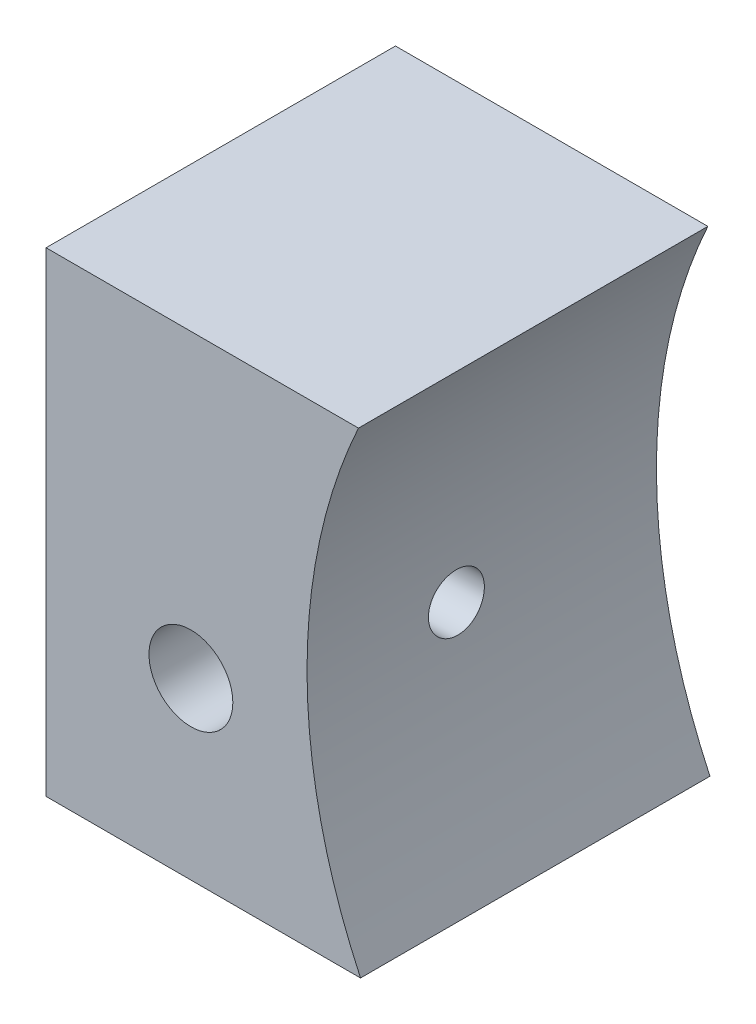
ISO-10303-21;
HEADER;
FILE_DESCRIPTION(('STEP AP214'),'2;1');
FILE_NAME('part.step','',(''),(''),'','','');
FILE_SCHEMA(('AUTOMOTIVE_DESIGN { 1 0 10303 214 1 1 1 1 }'));
ENDSEC;
DATA;
#1=APPLICATION_CONTEXT('core data for automotive mechanical design processes');
#2=APPLICATION_PROTOCOL_DEFINITION('international standard','automotive_design',2000,#1);
#3=PRODUCT_CONTEXT('',#1,'mechanical');
#4=PRODUCT('Part','Part','',(#3));
#5=PRODUCT_RELATED_PRODUCT_CATEGORY('part','',(#4));
#6=PRODUCT_DEFINITION_FORMATION('','',#4);
#7=PRODUCT_DEFINITION_CONTEXT('part definition',#1,'design');
#8=PRODUCT_DEFINITION('design','',#6,#7);
#9=PRODUCT_DEFINITION_SHAPE('','',#8);
#10=(LENGTH_UNIT() NAMED_UNIT(*) SI_UNIT(.MILLI.,.METRE.));
#11=(NAMED_UNIT(*) PLANE_ANGLE_UNIT() SI_UNIT($,.RADIAN.));
#12=(NAMED_UNIT(*) SI_UNIT($,.STERADIAN.) SOLID_ANGLE_UNIT());
#13=UNCERTAINTY_MEASURE_WITH_UNIT(LENGTH_MEASURE(1.E-05),#10,'distance_accuracy_value','');
#14=(GEOMETRIC_REPRESENTATION_CONTEXT(3) GLOBAL_UNCERTAINTY_ASSIGNED_CONTEXT((#13)) GLOBAL_UNIT_ASSIGNED_CONTEXT((#10,
#11,#12)) REPRESENTATION_CONTEXT('',''));
#15=CARTESIAN_POINT('',(0.,0.,0.));
#16=DIRECTION('',(0.,0.,1.));
#17=DIRECTION('',(1.,0.,0.));
#18=AXIS2_PLACEMENT_3D('',#15,#16,#17);
#19=CARTESIAN_POINT('',(118.09436297306,34.31875,0.));
#20=DIRECTION('',(0.,0.,1.));
#21=DIRECTION('',(1.,0.,0.));
#22=AXIS2_PLACEMENT_3D('',#19,#20,#21);
#23=PLANE('',#22);
#24=DIRECTION('',(1.,0.,0.));
#25=VECTOR('',#24,1.);
#26=CARTESIAN_POINT('',(0.,0.,0.));
#27=LINE('',#26,#25);
#28=CARTESIAN_POINT('',(0.,0.,0.));
#29=VERTEX_POINT('',#28);
#30=CARTESIAN_POINT('',(45.,0.,0.));
#31=VERTEX_POINT('',#30);
#32=EDGE_CURVE('E142',#29,#31,#27,.T.);
#33=ORIENTED_EDGE('',*,*,#32,.F.);
#34=DIRECTION('',(0.,-1.,0.));
#35=VECTOR('',#34,1.);
#36=CARTESIAN_POINT('',(0.,0.,0.));
#37=LINE('',#36,#35);
#38=CARTESIAN_POINT('',(0.,68.,0.));
#39=VERTEX_POINT('',#38);
#40=EDGE_CURVE('E90',#39,#29,#37,.T.);
#41=ORIENTED_EDGE('',*,*,#40,.F.);
#42=DIRECTION('',(-1.,0.,0.));
#43=VECTOR('',#42,1.);
#44=CARTESIAN_POINT('',(0.,68.,0.));
#45=LINE('',#44,#43);
#46=CARTESIAN_POINT('',(44.7040645785348,68.,0.));
#47=VERTEX_POINT('',#46);
#48=EDGE_CURVE('E173',#47,#39,#45,.T.);
#49=ORIENTED_EDGE('',*,*,#48,.F.);
#50=CARTESIAN_POINT('',(118.09436297306,34.31875,0.));
#51=DIRECTION('',(0.,0.,-1.));
#52=DIRECTION('',(1.,0.,0.));
#53=AXIS2_PLACEMENT_3D('',#50,#51,#52);
#54=CIRCLE('',#53,80.75);
#55=EDGE_CURVE('E146',#31,#47,#54,.T.);
#56=ORIENTED_EDGE('',*,*,#55,.F.);
#57=EDGE_LOOP('',(#33,#41,#49,#56));
#58=FACE_BOUND('',#57,.T.);
#59=DIRECTION('',(0.,-1.,0.));
#60=VECTOR('',#59,1.);
#61=CARTESIAN_POINT('',(10.,0.,0.));
#62=LINE('',#61,#60);
#63=CARTESIAN_POINT('',(10.,58.,0.));
#64=VERTEX_POINT('',#63);
#65=CARTESIAN_POINT('',(10.,10.,0.));
#66=VERTEX_POINT('',#65);
#67=EDGE_CURVE('E137',#64,#66,#62,.T.);
#68=ORIENTED_EDGE('',*,*,#67,.T.);
#69=DIRECTION('',(1.,0.,0.));
#70=VECTOR('',#69,1.);
#71=CARTESIAN_POINT('',(0.,10.,0.));
#72=LINE('',#71,#70);
#73=CARTESIAN_POINT('',(30.6634708442624,10.,0.));
#74=VERTEX_POINT('',#73);
#75=EDGE_CURVE('E159',#66,#74,#72,.T.);
#76=ORIENTED_EDGE('',*,*,#75,.T.);
#77=CARTESIAN_POINT('',(118.09436297306,34.31875,0.));
#78=DIRECTION('',(0.,0.,1.));
#79=DIRECTION('',(1.,0.,0.));
#80=AXIS2_PLACEMENT_3D('',#77,#78,#79);
#81=CIRCLE('',#80,90.75);
#82=CARTESIAN_POINT('',(30.4886502687082,58.,0.));
#83=VERTEX_POINT('',#82);
#84=EDGE_CURVE('E141',#74,#83,#81,.F.);
#85=ORIENTED_EDGE('',*,*,#84,.T.);
#86=DIRECTION('',(-1.,0.,0.));
#87=VECTOR('',#86,1.);
#88=CARTESIAN_POINT('',(0.,58.,0.));
#89=LINE('',#88,#87);
#90=EDGE_CURVE('E60',#83,#64,#89,.T.);
#91=ORIENTED_EDGE('',*,*,#90,.T.);
#92=EDGE_LOOP('',(#68,#76,#85,#91));
#93=FACE_BOUND('',#92,.T.);
#94=ADVANCED_FACE('F45',(#58,#93),#23,.F.);
#95=CARTESIAN_POINT('',(0.,0.,50.));
#96=DIRECTION('',(0.,1.,0.));
#97=DIRECTION('',(0.,0.,1.));
#98=AXIS2_PLACEMENT_3D('',#95,#96,#97);
#99=PLANE('',#98);
#100=ORIENTED_EDGE('',*,*,#32,.T.);
#101=DIRECTION('',(0.,0.,-1.));
#102=VECTOR('',#101,1.);
#103=CARTESIAN_POINT('',(45.,0.,50.));
#104=LINE('',#103,#102);
#105=CARTESIAN_POINT('',(45.,0.,50.));
#106=VERTEX_POINT('',#105);
#107=EDGE_CURVE('E13',#106,#31,#104,.T.);
#108=ORIENTED_EDGE('',*,*,#107,.F.);
#109=DIRECTION('',(1.,0.,0.));
#110=VECTOR('',#109,1.);
#111=CARTESIAN_POINT('',(0.,0.,50.));
#112=LINE('',#111,#110);
#113=CARTESIAN_POINT('',(0.,0.,50.));
#114=VERTEX_POINT('',#113);
#115=EDGE_CURVE('E165',#114,#106,#112,.T.);
#116=ORIENTED_EDGE('',*,*,#115,.F.);
#117=DIRECTION('',(0.,0.,-1.));
#118=VECTOR('',#117,1.);
#119=CARTESIAN_POINT('',(0.,0.,50.));
#120=LINE('',#119,#118);
#121=EDGE_CURVE('E170',#114,#29,#120,.T.);
#122=ORIENTED_EDGE('',*,*,#121,.T.);
#123=EDGE_LOOP('',(#100,#108,#116,#122));
#124=FACE_BOUND('',#123,.T.);
#125=ADVANCED_FACE('F47',(#124),#99,.F.);
#126=CARTESIAN_POINT('',(118.09436297306,34.31875,50.));
#127=DIRECTION('',(0.,0.,-1.));
#128=DIRECTION('',(-1.,0.,0.));
#129=AXIS2_PLACEMENT_3D('',#126,#127,#128);
#130=CYLINDRICAL_SURFACE('',#129,80.75);
#131=CARTESIAN_POINT('',(37.3746104368453,32.1087612008884,24.6578773271621));
#132=CARTESIAN_POINT('',(37.3807568795896,31.8843110658417,24.6578872374668));
#133=CARTESIAN_POINT('',(37.3878512210671,31.6597275242141,24.6768466668234));
#134=CARTESIAN_POINT('',(37.4036589538892,31.2168053991997,24.7522108195903));
#135=CARTESIAN_POINT('',(37.4123742448805,30.9984744935407,24.8086596797843));
#136=CARTESIAN_POINT('',(37.4309367804109,30.5745309010088,24.9573827069967));
#137=CARTESIAN_POINT('',(37.4407834469454,30.3689118017045,25.0496386374512));
#138=CARTESIAN_POINT('',(37.4609759097406,29.9761574115352,25.2673290299811));
#139=CARTESIAN_POINT('',(37.4713215875881,29.7890177673867,25.3927556521649));
#140=CARTESIAN_POINT('',(37.4917919200748,29.4382806426157,25.6733659566985));
#141=CARTESIAN_POINT('',(37.5019163747488,29.2747037697858,25.8285754135279));
#142=CARTESIAN_POINT('',(37.5211732109015,28.9758979159542,26.1642941935347));
#143=CARTESIAN_POINT('',(37.5303055518767,28.8406700921047,26.3448045489432));
#144=CARTESIAN_POINT('',(37.5468651989115,28.6023320361869,26.7261087630638));
#145=CARTESIAN_POINT('',(37.5542916538709,28.4992378270944,26.9269126750007));
#146=CARTESIAN_POINT('',(37.5668332935314,28.3281856034591,27.3430331397898));
#147=CARTESIAN_POINT('',(37.5719484955321,28.2602273259232,27.5583495840018));
#148=CARTESIAN_POINT('',(37.579443238675,28.1614227290926,27.9971939724753));
#149=CARTESIAN_POINT('',(37.5818250432235,28.1305457034551,28.2207149643857));
#150=CARTESIAN_POINT('',(37.5836626970293,28.1066818084065,28.6697813761541));
#151=CARTESIAN_POINT('',(37.5831185690469,28.1136946442566,28.8953267802508));
#152=CARTESIAN_POINT('',(37.5791515173443,28.1653866348335,29.3418305647575));
#153=CARTESIAN_POINT('',(37.5757311291072,28.2100326152455,29.5627928095904));
#154=CARTESIAN_POINT('',(37.5662978288935,28.335677224151,29.9940696962135));
#155=CARTESIAN_POINT('',(37.5602849061128,28.4166760041395,30.204384293627));
#156=CARTESIAN_POINT('',(37.5461540994893,28.6127736009246,30.6085028830176));
#157=CARTESIAN_POINT('',(37.5380352817041,28.7278875506769,30.802299498651));
#158=CARTESIAN_POINT('',(37.5203425183651,28.988948257962,31.1678002650064));
#159=CARTESIAN_POINT('',(37.5107685627424,29.134895228844,31.3395042628451));
#160=CARTESIAN_POINT('',(37.4908949521376,29.4536792223729,31.6561391688483));
#161=CARTESIAN_POINT('',(37.4805945273034,29.6265450129063,31.8010410671412));
#162=CARTESIAN_POINT('',(37.4600380478702,29.9941715107648,32.0597350036579));
#163=CARTESIAN_POINT('',(37.449781993282,30.1889322234114,32.1735270343205));
#164=CARTESIAN_POINT('',(37.4300195543148,30.5948483145438,32.3667683025164));
#165=CARTESIAN_POINT('',(37.420513191977,30.8060041746918,32.4462165306352));
#166=CARTESIAN_POINT('',(37.4028345693399,31.2387177097072,32.5684960005832));
#167=CARTESIAN_POINT('',(37.3946622992372,31.4602753081243,32.6113275114923));
#168=CARTESIAN_POINT('',(37.3800697282641,31.9072562553582,32.6591219687068));
#169=CARTESIAN_POINT('',(37.3736475779377,32.1326752536607,32.6641250413448));
#170=CARTESIAN_POINT('',(37.3627473725597,32.5812019204344,32.636225315246));
#171=CARTESIAN_POINT('',(37.3582693111995,32.8043095964037,32.6033226395175));
#172=CARTESIAN_POINT('',(37.3512489628592,33.2417642350766,32.5005786146279));
#173=CARTESIAN_POINT('',(37.3487057174108,33.4561154856679,32.4307555841558));
#174=CARTESIAN_POINT('',(37.3453437621743,33.8700977490188,32.2561714419016));
#175=CARTESIAN_POINT('',(37.3445250621282,34.0697286786159,32.1514101327544));
#176=CARTESIAN_POINT('',(37.3442447214512,34.4487771402456,31.9098204721075));
#177=CARTESIAN_POINT('',(37.3447842229823,34.6281775271364,31.7729652193695));
#178=CARTESIAN_POINT('',(37.3467486132194,34.961487191517,31.4711117995039));
#179=CARTESIAN_POINT('',(37.3481735075063,35.1153963083165,31.3061134549829));
#180=CARTESIAN_POINT('',(37.3513950215112,35.3934766721276,30.9524849492222));
#181=CARTESIAN_POINT('',(37.3531919632117,35.5176219583323,30.7638343746887));
#182=CARTESIAN_POINT('',(37.3566672239115,35.7324611099012,30.3683596773279));
#183=CARTESIAN_POINT('',(37.3583455434198,35.823155118837,30.1615356325053));
#184=CARTESIAN_POINT('',(37.3611835160575,35.9684623090216,29.7356811909144));
#185=CARTESIAN_POINT('',(37.3623434072923,36.0230920595018,29.5166564498159));
#186=CARTESIAN_POINT('',(37.3638881521092,36.0947680511964,29.0725387528664));
#187=CARTESIAN_POINT('',(37.3642730099835,36.1118145005596,28.8474458306301));
#188=CARTESIAN_POINT('',(37.3641847663751,36.1078360479694,28.3978397692256));
#189=CARTESIAN_POINT('',(37.3637125861794,36.0868520275282,28.173326266978));
#190=CARTESIAN_POINT('',(37.3620138608131,36.007495208418,27.7310103768305));
#191=CARTESIAN_POINT('',(37.3607873142027,35.9491223383921,27.5132080017396));
#192=CARTESIAN_POINT('',(37.3578529096789,35.7966596391878,27.0904883138793));
#193=CARTESIAN_POINT('',(37.3561450480518,35.7025695344138,26.8855711005464));
#194=CARTESIAN_POINT('',(37.3526573922934,35.4813602518458,26.4944259939258));
#195=CARTESIAN_POINT('',(37.350877600382,35.3542420926745,26.3081975245013));
#196=CARTESIAN_POINT('',(37.3477373787116,35.0704511723846,25.9595124384442));
#197=CARTESIAN_POINT('',(37.3463773554282,34.9137500001746,25.7970789427074));
#198=CARTESIAN_POINT('',(37.344593465728,34.5752719125296,25.5007574162014));
#199=CARTESIAN_POINT('',(37.3441698297408,34.3934888365345,25.3668764190612));
#200=CARTESIAN_POINT('',(37.3447258313263,34.009878965915,25.1313988427333));
#201=CARTESIAN_POINT('',(37.3457068011267,33.8080333115543,25.0298330252713));
#202=CARTESIAN_POINT('',(37.3494314301799,33.3903254739539,24.8621451107246));
#203=CARTESIAN_POINT('',(37.3521729983707,33.1744801911068,24.7959811375555));
#204=CARTESIAN_POINT('',(37.3582293287252,32.8158716946509,24.7183351965825));
#205=CARTESIAN_POINT('',(37.360962738357,32.6754165527053,24.6956924283148));
#206=CARTESIAN_POINT('',(37.3672075951492,32.3929124978143,24.6654603627273));
#207=CARTESIAN_POINT('',(37.3707190416586,32.2508635862021,24.6578710528155));
#208=CARTESIAN_POINT('',(37.3746104368453,32.1087612008884,24.6578773271621));
#209=B_SPLINE_CURVE_WITH_KNOTS('',3,(#131,#132,#133,#134,#135,#136,#137,#138,#139,#140,#141,
#142,#143,#144,#145,#146,#147,#148,#149,#150,#151,#152,#153,#154,#155,#156,#157,#158,#159,#160,
#161,#162,#163,#164,#165,#166,#167,#168,#169,#170,#171,#172,#173,#174,#175,#176,#177,#178,#179,
#180,#181,#182,#183,#184,#185,#186,#187,#188,#189,#190,#191,#192,#193,#194,#195,#196,#197,#198,
#199,#200,#201,#202,#203,#204,#205,#206,#207,#208),.UNSPECIFIED.,.T.,.F.,(4,2,2,2,2,2,2,2,2,2,2,
2,2,2,2,2,2,2,2,2,2,2,2,2,2,2,2,2,2,2,2,2,2,2,2,2,2,2,4),(0.,0.673083913030135,1.34696166439825,
2.02049665879742,2.69387260527462,3.36783395051485,4.04182280017426,4.71614718924909,
5.39046653092466,6.06422709454448,6.73798241710312,7.41114443222416,8.08430925267697,
8.75777312660485,9.43124166072346,10.1054349271839,10.7796283575065,11.4538416020117,
12.1280498919815,12.8015429183084,13.4750337590829,14.1481907485563,14.8213515407308,
15.4950786078624,16.168809921834,16.8431267615785,17.5174407071496,18.1914446323723,
18.8654448247283,19.538720918599,20.2119982974268,20.8852808713938,21.5585426830246,
22.2324544053832,22.9065319480414,23.5812492574048,24.2551666837332,24.6813054764119,
25.1074439126304),.UNSPECIFIED.);
#210=CARTESIAN_POINT('',(37.3746104368453,32.1087612008884,24.6578773271621));
#211=VERTEX_POINT('',#210);
#212=EDGE_CURVE('E233',#211,#211,#209,.T.);
#213=ORIENTED_EDGE('',*,*,#212,.T.);
#214=EDGE_LOOP('',(#213));
#215=FACE_BOUND('',#214,.T.);
#216=ORIENTED_EDGE('',*,*,#55,.T.);
#217=DIRECTION('',(0.,0.,-1.));
#218=VECTOR('',#217,1.);
#219=CARTESIAN_POINT('',(44.7040645785348,68.,50.));
#220=LINE('',#219,#218);
#221=CARTESIAN_POINT('',(44.7040645785348,68.,50.));
#222=VERTEX_POINT('',#221);
#223=EDGE_CURVE('E53',#222,#47,#220,.T.);
#224=ORIENTED_EDGE('',*,*,#223,.F.);
#225=CARTESIAN_POINT('',(118.09436297306,34.31875,50.));
#226=DIRECTION('',(0.,0.,-1.));
#227=DIRECTION('',(1.,0.,0.));
#228=AXIS2_PLACEMENT_3D('',#225,#226,#227);
#229=CIRCLE('',#228,80.75);
#230=EDGE_CURVE('E97',#106,#222,#229,.T.);
#231=ORIENTED_EDGE('',*,*,#230,.F.);
#232=ORIENTED_EDGE('',*,*,#107,.T.);
#233=EDGE_LOOP('',(#216,#224,#231,#232));
#234=FACE_BOUND('',#233,.T.);
#235=ADVANCED_FACE('F200',(#215,#234),#130,.F.);
#236=CARTESIAN_POINT('',(0.,68.,50.));
#237=DIRECTION('',(0.,-1.,0.));
#238=DIRECTION('',(0.,0.,-1.));
#239=AXIS2_PLACEMENT_3D('',#236,#237,#238);
#240=PLANE('',#239);
#241=ORIENTED_EDGE('',*,*,#48,.T.);
#242=DIRECTION('',(0.,0.,-1.));
#243=VECTOR('',#242,1.);
#244=CARTESIAN_POINT('',(0.,68.,50.));
#245=LINE('',#244,#243);
#246=CARTESIAN_POINT('',(0.,68.,50.));
#247=VERTEX_POINT('',#246);
#248=EDGE_CURVE('E177',#247,#39,#245,.T.);
#249=ORIENTED_EDGE('',*,*,#248,.F.);
#250=DIRECTION('',(-1.,0.,0.));
#251=VECTOR('',#250,1.);
#252=CARTESIAN_POINT('',(0.,68.,50.));
#253=LINE('',#252,#251);
#254=EDGE_CURVE('E168',#222,#247,#253,.T.);
#255=ORIENTED_EDGE('',*,*,#254,.F.);
#256=ORIENTED_EDGE('',*,*,#223,.T.);
#257=EDGE_LOOP('',(#241,#249,#255,#256));
#258=FACE_BOUND('',#257,.T.);
#259=ADVANCED_FACE('F182',(#258),#240,.F.);
#260=CARTESIAN_POINT('',(0.,0.,50.));
#261=DIRECTION('',(1.,0.,0.));
#262=DIRECTION('',(0.,0.,-1.));
#263=AXIS2_PLACEMENT_3D('',#260,#261,#262);
#264=PLANE('',#263);
#265=ORIENTED_EDGE('',*,*,#40,.T.);
#266=ORIENTED_EDGE('',*,*,#121,.F.);
#267=DIRECTION('',(0.,-1.,0.));
#268=VECTOR('',#267,1.);
#269=CARTESIAN_POINT('',(0.,0.,50.));
#270=LINE('',#269,#268);
#271=EDGE_CURVE('E69',#247,#114,#270,.T.);
#272=ORIENTED_EDGE('',*,*,#271,.F.);
#273=ORIENTED_EDGE('',*,*,#248,.T.);
#274=EDGE_LOOP('',(#265,#266,#272,#273));
#275=FACE_BOUND('',#274,.T.);
#276=ADVANCED_FACE('F190',(#275),#264,.F.);
#277=CARTESIAN_POINT('',(118.09436297306,34.31875,50.));
#278=DIRECTION('',(0.,0.,1.));
#279=DIRECTION('',(1.,0.,0.));
#280=AXIS2_PLACEMENT_3D('',#277,#278,#279);
#281=PLANE('',#280);
#282=CARTESIAN_POINT('',(20.7264375387695,25.,50.));
#283=DIRECTION('',(0.,0.,1.));
#284=DIRECTION('',(1.,0.,0.));
#285=AXIS2_PLACEMENT_3D('',#282,#283,#284);
#286=CIRCLE('',#285,5.99999999999999);
#287=CARTESIAN_POINT('',(26.7264375387695,25.,50.));
#288=VERTEX_POINT('',#287);
#289=EDGE_CURVE('E238',#288,#288,#286,.T.);
#290=ORIENTED_EDGE('',*,*,#289,.F.);
#291=EDGE_LOOP('',(#290));
#292=FACE_BOUND('',#291,.T.);
#293=ORIENTED_EDGE('',*,*,#115,.T.);
#294=ORIENTED_EDGE('',*,*,#230,.T.);
#295=ORIENTED_EDGE('',*,*,#254,.T.);
#296=ORIENTED_EDGE('',*,*,#271,.T.);
#297=EDGE_LOOP('',(#293,#294,#295,#296));
#298=FACE_BOUND('',#297,.T.);
#299=ADVANCED_FACE('F192',(#292,#298),#281,.T.);
#300=CARTESIAN_POINT('',(0.,10.,50.));
#301=DIRECTION('',(0.,1.,0.));
#302=DIRECTION('',(0.,0.,1.));
#303=AXIS2_PLACEMENT_3D('',#300,#301,#302);
#304=PLANE('',#303);
#305=ORIENTED_EDGE('',*,*,#75,.F.);
#306=DIRECTION('',(0.,0.,-1.));
#307=VECTOR('',#306,1.);
#308=CARTESIAN_POINT('',(10.,10.,50.));
#309=LINE('',#308,#307);
#310=CARTESIAN_POINT('',(10.,10.,40.));
#311=VERTEX_POINT('',#310);
#312=EDGE_CURVE('E136',#311,#66,#309,.T.);
#313=ORIENTED_EDGE('',*,*,#312,.F.);
#314=DIRECTION('',(1.,0.,0.));
#315=VECTOR('',#314,1.);
#316=CARTESIAN_POINT('',(0.,10.,40.));
#317=LINE('',#316,#315);
#318=CARTESIAN_POINT('',(30.6634708442624,10.,40.));
#319=VERTEX_POINT('',#318);
#320=EDGE_CURVE('E124',#311,#319,#317,.T.);
#321=ORIENTED_EDGE('',*,*,#320,.T.);
#322=DIRECTION('',(0.,0.,-1.));
#323=VECTOR('',#322,1.);
#324=CARTESIAN_POINT('',(30.6634708442624,10.,40.));
#325=LINE('',#324,#323);
#326=EDGE_CURVE('E134',#319,#74,#325,.T.);
#327=ORIENTED_EDGE('',*,*,#326,.T.);
#328=EDGE_LOOP('',(#305,#313,#321,#327));
#329=FACE_BOUND('',#328,.T.);
#330=ADVANCED_FACE('F133',(#329),#304,.T.);
#331=CARTESIAN_POINT('',(118.09436297306,34.31875,50.));
#332=DIRECTION('',(0.,0.,-1.));
#333=DIRECTION('',(-1.,0.,0.));
#334=AXIS2_PLACEMENT_3D('',#331,#332,#333);
#335=CYLINDRICAL_SURFACE('',#334,90.75);
#336=CARTESIAN_POINT('',(27.3570472930685,35.8359985589053,28.6578820271621));
#337=CARTESIAN_POINT('',(27.3570463784239,35.8359886081159,28.43331712587));
#338=CARTESIAN_POINT('',(27.3567235878608,35.8170080829087,28.2085921717298));
#339=CARTESIAN_POINT('',(27.3555097842553,35.7415607947953,27.7653393411073));
#340=CARTESIAN_POINT('',(27.3546180985364,35.6850496514609,27.5468191211903));
#341=CARTESIAN_POINT('',(27.3524988230276,35.5361658685935,27.1224610107553));
#342=CARTESIAN_POINT('',(27.3512714021585,35.4438112534698,26.9166168061053));
#343=CARTESIAN_POINT('',(27.3488319633163,35.2258978435376,26.5233980537592));
#344=CARTESIAN_POINT('',(27.3476199417366,35.1003469796255,26.3360191091969));
#345=CARTESIAN_POINT('',(27.3456361271201,34.8195000706062,25.9848400450282));
#346=CARTESIAN_POINT('',(27.3448646480027,34.664182919787,25.821056801108));
#347=CARTESIAN_POINT('',(27.3442083729888,34.3282651068575,25.5218618356594));
#348=CARTESIAN_POINT('',(27.3443236129689,34.147663422027,25.3864512623148));
#349=CARTESIAN_POINT('',(27.3458447766848,33.7662311024291,25.1478030312949));
#350=CARTESIAN_POINT('',(27.3472512023312,33.5653926282336,25.0445779056712));
#351=CARTESIAN_POINT('',(27.3516606221985,33.1492526916827,24.873311364366));
#352=CARTESIAN_POINT('',(27.3546636063171,32.9339513208491,24.8052697260657));
#353=CARTESIAN_POINT('',(27.3624221292932,32.4951535410898,24.706344508098));
#354=CARTESIAN_POINT('',(27.3671765171106,32.2716626011073,24.6754365805111));
#355=CARTESIAN_POINT('',(27.378417910782,31.8227079863328,24.6515810352995));
#356=CARTESIAN_POINT('',(27.3849049053404,31.597244324411,24.6586331702028));
#357=CARTESIAN_POINT('',(27.3993955469581,31.1509084061963,24.710477286397));
#358=CARTESIAN_POINT('',(27.4073981372801,30.9300330690974,24.7552430467034));
#359=CARTESIAN_POINT('',(27.4245314039515,30.498972097594,24.8812030532134));
#360=CARTESIAN_POINT('',(27.4336620842521,30.2887865006332,24.962397427008));
#361=CARTESIAN_POINT('',(27.4525123016022,29.8849792303976,25.1589398198408));
#362=CARTESIAN_POINT('',(27.4622320441095,29.6913633939111,25.2742998105944));
#363=CARTESIAN_POINT('',(27.4816106914181,29.3262452343388,25.535890016494));
#364=CARTESIAN_POINT('',(27.4912695958907,29.1547430306598,25.6821203983193));
#365=CARTESIAN_POINT('',(27.5098436593467,28.8385563182693,26.0014487354043));
#366=CARTESIAN_POINT('',(27.5187581787282,28.6938947441872,26.1745694378447));
#367=CARTESIAN_POINT('',(27.5351637837964,28.435660787975,26.5426841440232));
#368=CARTESIAN_POINT('',(27.5426548691635,28.3220884128269,26.7376781526735));
#369=CARTESIAN_POINT('',(27.5556311403137,28.1292487967293,27.1440178416647));
#370=CARTESIAN_POINT('',(27.5611162781181,28.0499823763068,27.3553639129704));
#371=CARTESIAN_POINT('',(27.5696440262199,27.9280121936894,27.7884022851374));
#372=CARTESIAN_POINT('',(27.5726866507997,27.8853082176978,28.0100945254922));
#373=CARTESIAN_POINT('',(27.5760827180315,27.8376990523415,28.4573324346316));
#374=CARTESIAN_POINT('',(27.576438421302,27.8327620879744,28.682874704044));
#375=CARTESIAN_POINT('',(27.5744378527605,27.8607436986001,29.1315859166222));
#376=CARTESIAN_POINT('',(27.5720815878849,27.8936621767688,29.354754865857));
#377=CARTESIAN_POINT('',(27.5648485674817,27.9963972579474,29.7922953111567));
#378=CARTESIAN_POINT('',(27.5599728030752,28.0661993519195,30.0066702308508));
#379=CARTESIAN_POINT('',(27.5480899201066,28.2407123893934,30.4206426590866));
#380=CARTESIAN_POINT('',(27.541082792002,28.3454234891905,30.6202401014614));
#381=CARTESIAN_POINT('',(27.5254793521164,28.586873410784,30.9991382233131));
#382=CARTESIAN_POINT('',(27.5168819804327,28.7236336097351,31.1784252365531));
#383=CARTESIAN_POINT('',(27.4987535889266,29.0252795501804,31.5114758013848));
#384=CARTESIAN_POINT('',(27.4892225643869,29.1901654337789,31.6652392240114));
#385=CARTESIAN_POINT('',(27.4699123671013,29.5435302162931,31.9429845337539));
#386=CARTESIAN_POINT('',(27.460133028291,29.7320252542415,32.0669458775342));
#387=CARTESIAN_POINT('',(27.4409991376952,30.127186676521,32.2814278088726));
#388=CARTESIAN_POINT('',(27.4316445843699,30.3338529949745,32.371948517659));
#389=CARTESIAN_POINT('',(27.4139406766915,30.7594222925492,32.516943646603));
#390=CARTESIAN_POINT('',(27.4055909551821,30.9783207590843,32.5714312658278));
#391=CARTESIAN_POINT('',(27.3903286150633,31.4222092164244,32.6428567521263));
#392=CARTESIAN_POINT('',(27.3834159907325,31.6471991829741,32.6597947686942));
#393=CARTESIAN_POINT('',(27.3712930488989,32.0966815828969,32.6556387283253));
#394=CARTESIAN_POINT('',(27.3660812918516,32.3211742764527,32.6345769319685));
#395=CARTESIAN_POINT('',(27.3574213309725,32.7634783825626,32.5550857281944));
#396=CARTESIAN_POINT('',(27.3539731305315,32.9812897822697,32.4966562489293));
#397=CARTESIAN_POINT('',(27.3487264205355,33.4040505131855,32.3440944585568));
#398=CARTESIAN_POINT('',(27.3469279298909,33.6089996969315,32.2499617382058));
#399=CARTESIAN_POINT('',(27.3447108980998,34.0002164621587,32.0286720478954));
#400=CARTESIAN_POINT('',(27.3442923119802,34.1864846522903,31.9015161543576));
#401=CARTESIAN_POINT('',(27.3444531575705,34.5352003156198,31.6176773654733));
#402=CARTESIAN_POINT('',(27.345033328791,34.6976300414344,31.4609726677964));
#403=CARTESIAN_POINT('',(27.3467533712514,34.9939308404882,31.1224859667276));
#404=CARTESIAN_POINT('',(27.3478933804652,35.1277948619426,30.9406977893746));
#405=CARTESIAN_POINT('',(27.3502968635245,35.3632020069212,30.5570866403704));
#406=CARTESIAN_POINT('',(27.3515604415305,35.4647175504581,30.3552467641182));
#407=CARTESIAN_POINT('',(27.353830541668,35.6322805673964,29.9375351239935));
#408=CARTESIAN_POINT('',(27.3548373676943,35.6983700745921,29.7216803317592));
#409=CARTESIAN_POINT('',(27.3560560901236,35.7758003873947,29.3633774277996));
#410=CARTESIAN_POINT('',(27.3564242363153,35.7983459419366,29.2232518763579));
#411=CARTESIAN_POINT('',(27.356920126463,35.8284481642502,28.9413994942799));
#412=CARTESIAN_POINT('',(27.3570478705766,35.8360048418497,28.7996726646937));
#413=CARTESIAN_POINT('',(27.3570472930685,35.8359985589053,28.6578820271621));
#414=B_SPLINE_CURVE_WITH_KNOTS('',3,(#336,#337,#338,#339,#340,#341,#342,#343,#344,#345,#346,
#347,#348,#349,#350,#351,#352,#353,#354,#355,#356,#357,#358,#359,#360,#361,#362,#363,#364,#365,
#366,#367,#368,#369,#370,#371,#372,#373,#374,#375,#376,#377,#378,#379,#380,#381,#382,#383,#384,
#385,#386,#387,#388,#389,#390,#391,#392,#393,#394,#395,#396,#397,#398,#399,#400,#401,#402,#403,
#404,#405,#406,#407,#408,#409,#410,#411,#412,#413),.UNSPECIFIED.,.T.,.F.,(4,2,2,2,2,2,2,2,2,2,2,
2,2,2,2,2,2,2,2,2,2,2,2,2,2,2,2,2,2,2,2,2,2,2,2,2,2,2,4),(0.,0.673177126211521,1.34715171361771,
2.02078782135246,2.69426313627039,3.36821775582854,4.04219964368322,4.71644363316685,
5.39068335640645,6.0644807508525,6.73827375263284,7.41159867559511,8.0849259568899,
8.75848945340957,9.43205658681132,10.1061966418242,10.7803368482328,11.4544931777814,
12.1286455652156,12.8022306969582,13.4758141058521,14.1491327419142,14.8224543926125,
15.4962264421413,16.1700018959869,16.844240477289,17.5184766143304,18.1924656389265,
18.8664519802022,19.5398663986632,20.2132821119181,20.8867055443436,21.5601070286502,
22.2340073345432,22.9080738088036,23.5827134571712,24.256550848425,24.6815962403467,
25.1066413535769),.UNSPECIFIED.);
#415=CARTESIAN_POINT('',(27.3570472930685,35.8359985589053,28.6578820271621));
#416=VERTEX_POINT('',#415);
#417=EDGE_CURVE('E239',#416,#416,#414,.T.);
#418=ORIENTED_EDGE('',*,*,#417,.F.);
#419=EDGE_LOOP('',(#418));
#420=FACE_BOUND('',#419,.T.);
#421=ORIENTED_EDGE('',*,*,#84,.F.);
#422=ORIENTED_EDGE('',*,*,#326,.F.);
#423=CARTESIAN_POINT('',(118.09436297306,34.31875,40.));
#424=DIRECTION('',(0.,0.,1.));
#425=DIRECTION('',(1.,0.,0.));
#426=AXIS2_PLACEMENT_3D('',#423,#424,#425);
#427=CIRCLE('',#426,90.75);
#428=CARTESIAN_POINT('',(30.4886502687082,58.,40.));
#429=VERTEX_POINT('',#428);
#430=EDGE_CURVE('E120',#319,#429,#427,.F.);
#431=ORIENTED_EDGE('',*,*,#430,.T.);
#432=DIRECTION('',(0.,0.,-1.));
#433=VECTOR('',#432,1.);
#434=CARTESIAN_POINT('',(30.4886502687082,58.,40.));
#435=LINE('',#434,#433);
#436=EDGE_CURVE('E143',#429,#83,#435,.T.);
#437=ORIENTED_EDGE('',*,*,#436,.T.);
#438=EDGE_LOOP('',(#421,#422,#431,#437));
#439=FACE_BOUND('',#438,.T.);
#440=ADVANCED_FACE('F139',(#420,#439),#335,.T.);
#441=CARTESIAN_POINT('',(0.,58.,50.));
#442=DIRECTION('',(0.,-1.,0.));
#443=DIRECTION('',(0.,0.,-1.));
#444=AXIS2_PLACEMENT_3D('',#441,#442,#443);
#445=PLANE('',#444);
#446=ORIENTED_EDGE('',*,*,#90,.F.);
#447=ORIENTED_EDGE('',*,*,#436,.F.);
#448=DIRECTION('',(-1.,0.,0.));
#449=VECTOR('',#448,1.);
#450=CARTESIAN_POINT('',(0.,58.,40.));
#451=LINE('',#450,#449);
#452=CARTESIAN_POINT('',(10.,58.,40.));
#453=VERTEX_POINT('',#452);
#454=EDGE_CURVE('E125',#429,#453,#451,.T.);
#455=ORIENTED_EDGE('',*,*,#454,.T.);
#456=DIRECTION('',(0.,0.,-1.));
#457=VECTOR('',#456,1.);
#458=CARTESIAN_POINT('',(10.,58.,50.));
#459=LINE('',#458,#457);
#460=EDGE_CURVE('E148',#453,#64,#459,.T.);
#461=ORIENTED_EDGE('',*,*,#460,.T.);
#462=EDGE_LOOP('',(#446,#447,#455,#461));
#463=FACE_BOUND('',#462,.T.);
#464=ADVANCED_FACE('F215',(#463),#445,.T.);
#465=CARTESIAN_POINT('',(10.,0.,50.));
#466=DIRECTION('',(1.,0.,0.));
#467=DIRECTION('',(0.,0.,-1.));
#468=AXIS2_PLACEMENT_3D('',#465,#466,#467);
#469=PLANE('',#468);
#470=ORIENTED_EDGE('',*,*,#67,.F.);
#471=ORIENTED_EDGE('',*,*,#460,.F.);
#472=DIRECTION('',(0.,-1.,0.));
#473=VECTOR('',#472,1.);
#474=CARTESIAN_POINT('',(10.,0.,40.));
#475=LINE('',#474,#473);
#476=EDGE_CURVE('E154',#453,#311,#475,.T.);
#477=ORIENTED_EDGE('',*,*,#476,.T.);
#478=ORIENTED_EDGE('',*,*,#312,.T.);
#479=EDGE_LOOP('',(#470,#471,#477,#478));
#480=FACE_BOUND('',#479,.T.);
#481=ADVANCED_FACE('F211',(#480),#469,.T.);
#482=CARTESIAN_POINT('',(118.09436297306,34.31875,40.));
#483=DIRECTION('',(0.,0.,1.));
#484=DIRECTION('',(1.,0.,0.));
#485=AXIS2_PLACEMENT_3D('',#482,#483,#484);
#486=PLANE('',#485);
#487=CARTESIAN_POINT('',(20.7264375387695,25.,40.));
#488=DIRECTION('',(0.,0.,1.));
#489=DIRECTION('',(1.,0.,0.));
#490=AXIS2_PLACEMENT_3D('',#487,#488,#489);
#491=CIRCLE('',#490,5.99999999999999);
#492=CARTESIAN_POINT('',(26.7264375387695,25.,40.));
#493=VERTEX_POINT('',#492);
#494=EDGE_CURVE('E151',#493,#493,#491,.T.);
#495=ORIENTED_EDGE('',*,*,#494,.T.);
#496=EDGE_LOOP('',(#495));
#497=FACE_BOUND('',#496,.T.);
#498=ORIENTED_EDGE('',*,*,#320,.F.);
#499=ORIENTED_EDGE('',*,*,#476,.F.);
#500=ORIENTED_EDGE('',*,*,#454,.F.);
#501=ORIENTED_EDGE('',*,*,#430,.F.);
#502=EDGE_LOOP('',(#498,#499,#500,#501));
#503=FACE_BOUND('',#502,.T.);
#504=ADVANCED_FACE('F122',(#497,#503),#486,.F.);
#505=CARTESIAN_POINT('',(20.7264375387695,25.,50.));
#506=DIRECTION('',(0.,0.,1.));
#507=DIRECTION('',(1.,0.,0.));
#508=AXIS2_PLACEMENT_3D('',#505,#506,#507);
#509=CYLINDRICAL_SURFACE('',#508,5.99999999999999);
#510=ORIENTED_EDGE('',*,*,#289,.T.);
#511=EDGE_LOOP('',(#510));
#512=FACE_BOUND('',#511,.T.);
#513=ORIENTED_EDGE('',*,*,#494,.F.);
#514=EDGE_LOOP('',(#513));
#515=FACE_BOUND('',#514,.T.);
#516=ADVANCED_FACE('F210',(#512,#515),#509,.F.);
#517=CARTESIAN_POINT('',(37.3746104368453,32.1087612008884,28.6578820271621));
#518=DIRECTION('',(0.999625418405141,0.0273682823419389,0.));
#519=DIRECTION('',(-0.0273682823419389,0.999625418405141,0.));
#520=AXIS2_PLACEMENT_3D('',#517,#518,#519);
#521=CYLINDRICAL_SURFACE('',#520,4.00000469999999);
#522=ORIENTED_EDGE('',*,*,#212,.F.);
#523=EDGE_LOOP('',(#522));
#524=FACE_BOUND('',#523,.T.);
#525=ORIENTED_EDGE('',*,*,#417,.T.);
#526=EDGE_LOOP('',(#525));
#527=FACE_BOUND('',#526,.T.);
#528=ADVANCED_FACE('F226',(#524,#527),#521,.F.);
#529=CLOSED_SHELL('',(#94,#125,#235,#259,#276,#299,#330,#440,#464,#481,#504,#516,#528));
#530=MANIFOLD_SOLID_BREP('B2',#529);
#531=ADVANCED_BREP_SHAPE_REPRESENTATION('',(#18,#530),#14);
#532=SHAPE_DEFINITION_REPRESENTATION(#9,#531);
ENDSEC;
END-ISO-10303-21;
